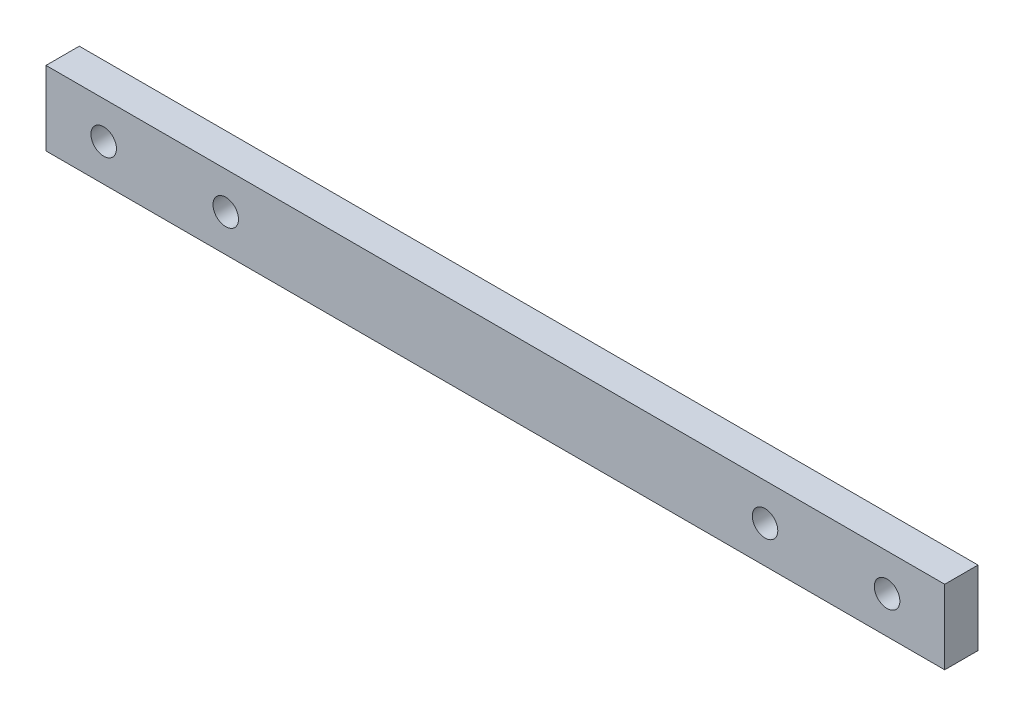
ISO-10303-21;
HEADER;
FILE_DESCRIPTION(('STEP AP214'),'2;1');
FILE_NAME('part.step','',(''),(''),'','','');
FILE_SCHEMA(('AUTOMOTIVE_DESIGN { 1 0 10303 214 1 1 1 1 }'));
ENDSEC;
DATA;
#1=APPLICATION_CONTEXT('core data for automotive mechanical design processes');
#2=APPLICATION_PROTOCOL_DEFINITION('international standard','automotive_design',2000,#1);
#3=PRODUCT_CONTEXT('',#1,'mechanical');
#4=PRODUCT('Part','Part','',(#3));
#5=PRODUCT_RELATED_PRODUCT_CATEGORY('part','',(#4));
#6=PRODUCT_DEFINITION_FORMATION('','',#4);
#7=PRODUCT_DEFINITION_CONTEXT('part definition',#1,'design');
#8=PRODUCT_DEFINITION('design','',#6,#7);
#9=PRODUCT_DEFINITION_SHAPE('','',#8);
#10=(LENGTH_UNIT() NAMED_UNIT(*) SI_UNIT(.MILLI.,.METRE.));
#11=(NAMED_UNIT(*) PLANE_ANGLE_UNIT() SI_UNIT($,.RADIAN.));
#12=(NAMED_UNIT(*) SI_UNIT($,.STERADIAN.) SOLID_ANGLE_UNIT());
#13=UNCERTAINTY_MEASURE_WITH_UNIT(LENGTH_MEASURE(1.E-05),#10,'distance_accuracy_value','');
#14=(GEOMETRIC_REPRESENTATION_CONTEXT(3) GLOBAL_UNCERTAINTY_ASSIGNED_CONTEXT((#13)) GLOBAL_UNIT_ASSIGNED_CONTEXT((#10,
#11,#12)) REPRESENTATION_CONTEXT('',''));
#15=CARTESIAN_POINT('',(0.,0.,0.));
#16=DIRECTION('',(0.,0.,1.));
#17=DIRECTION('',(1.,0.,0.));
#18=AXIS2_PLACEMENT_3D('',#15,#16,#17);
#19=CARTESIAN_POINT('',(0.,0.,3.));
#20=DIRECTION('',(0.,0.,-1.));
#21=DIRECTION('',(-1.,0.,0.));
#22=AXIS2_PLACEMENT_3D('',#19,#20,#21);
#23=PLANE('',#22);
#24=DIRECTION('',(0.,1.,0.));
#25=VECTOR('',#24,1.);
#26=CARTESIAN_POINT('',(40.497,-10.59,3.));
#27=LINE('',#26,#25);
#28=CARTESIAN_POINT('',(40.497,-17.27,3.));
#29=VERTEX_POINT('',#28);
#30=CARTESIAN_POINT('',(40.497,-10.59,3.));
#31=VERTEX_POINT('',#30);
#32=EDGE_CURVE('E92',#29,#31,#27,.T.);
#33=ORIENTED_EDGE('',*,*,#32,.T.);
#34=DIRECTION('',(-1.,0.,0.));
#35=VECTOR('',#34,1.);
#36=CARTESIAN_POINT('',(-40.497,-10.59,3.));
#37=LINE('',#36,#35);
#38=CARTESIAN_POINT('',(-40.497,-10.59,3.));
#39=VERTEX_POINT('',#38);
#40=EDGE_CURVE('E87',#31,#39,#37,.T.);
#41=ORIENTED_EDGE('',*,*,#40,.T.);
#42=DIRECTION('',(0.,-1.,0.));
#43=VECTOR('',#42,1.);
#44=CARTESIAN_POINT('',(-40.497,-17.27,3.));
#45=LINE('',#44,#43);
#46=CARTESIAN_POINT('',(-40.497,-17.27,3.));
#47=VERTEX_POINT('',#46);
#48=EDGE_CURVE('E90',#39,#47,#45,.T.);
#49=ORIENTED_EDGE('',*,*,#48,.T.);
#50=DIRECTION('',(1.,0.,0.));
#51=VECTOR('',#50,1.);
#52=CARTESIAN_POINT('',(40.497,-17.27,3.));
#53=LINE('',#52,#51);
#54=EDGE_CURVE('E57',#47,#29,#53,.T.);
#55=ORIENTED_EDGE('',*,*,#54,.T.);
#56=EDGE_LOOP('',(#33,#41,#49,#55));
#57=FACE_BOUND('',#56,.T.);
#58=CARTESIAN_POINT('',(-35.297,-13.93,3.));
#59=DIRECTION('',(0.,0.,1.));
#60=DIRECTION('',(1.,0.,0.));
#61=AXIS2_PLACEMENT_3D('',#58,#59,#60);
#62=CIRCLE('',#61,1.14999999999999);
#63=CARTESIAN_POINT('',(-34.147,-13.93,3.));
#64=VERTEX_POINT('',#63);
#65=EDGE_CURVE('E112',#64,#64,#62,.T.);
#66=ORIENTED_EDGE('',*,*,#65,.F.);
#67=EDGE_LOOP('',(#66));
#68=FACE_BOUND('',#67,.T.);
#69=CARTESIAN_POINT('',(-24.297,-13.93,3.));
#70=DIRECTION('',(0.,0.,1.));
#71=DIRECTION('',(1.,0.,0.));
#72=AXIS2_PLACEMENT_3D('',#69,#70,#71);
#73=CIRCLE('',#72,1.15);
#74=CARTESIAN_POINT('',(-23.147,-13.93,3.));
#75=VERTEX_POINT('',#74);
#76=EDGE_CURVE('E134',#75,#75,#73,.T.);
#77=ORIENTED_EDGE('',*,*,#76,.F.);
#78=EDGE_LOOP('',(#77));
#79=FACE_BOUND('',#78,.T.);
#80=CARTESIAN_POINT('',(24.303,-13.93,3.));
#81=DIRECTION('',(0.,0.,1.));
#82=DIRECTION('',(1.,0.,0.));
#83=AXIS2_PLACEMENT_3D('',#80,#81,#82);
#84=CIRCLE('',#83,1.15);
#85=CARTESIAN_POINT('',(25.453,-13.93,3.));
#86=VERTEX_POINT('',#85);
#87=EDGE_CURVE('E142',#86,#86,#84,.T.);
#88=ORIENTED_EDGE('',*,*,#87,.F.);
#89=EDGE_LOOP('',(#88));
#90=FACE_BOUND('',#89,.T.);
#91=CARTESIAN_POINT('',(35.303,-13.93,3.));
#92=DIRECTION('',(0.,0.,1.));
#93=DIRECTION('',(1.,0.,0.));
#94=AXIS2_PLACEMENT_3D('',#91,#92,#93);
#95=CIRCLE('',#94,1.14999999999999);
#96=CARTESIAN_POINT('',(36.453,-13.93,3.));
#97=VERTEX_POINT('',#96);
#98=EDGE_CURVE('E150',#97,#97,#95,.T.);
#99=ORIENTED_EDGE('',*,*,#98,.F.);
#100=EDGE_LOOP('',(#99));
#101=FACE_BOUND('',#100,.T.);
#102=ADVANCED_FACE('F39',(#57,#68,#79,#90,#101),#23,.F.);
#103=CARTESIAN_POINT('',(0.,0.,0.));
#104=DIRECTION('',(0.,0.,-1.));
#105=DIRECTION('',(-1.,0.,0.));
#106=AXIS2_PLACEMENT_3D('',#103,#104,#105);
#107=PLANE('',#106);
#108=CARTESIAN_POINT('',(24.303,-13.93,0.));
#109=DIRECTION('',(0.,0.,1.));
#110=DIRECTION('',(1.,0.,0.));
#111=AXIS2_PLACEMENT_3D('',#108,#109,#110);
#112=CIRCLE('',#111,1.15);
#113=CARTESIAN_POINT('',(25.453,-13.93,0.));
#114=VERTEX_POINT('',#113);
#115=EDGE_CURVE('E146',#114,#114,#112,.T.);
#116=ORIENTED_EDGE('',*,*,#115,.T.);
#117=EDGE_LOOP('',(#116));
#118=FACE_BOUND('',#117,.T.);
#119=CARTESIAN_POINT('',(-35.297,-13.93,0.));
#120=DIRECTION('',(0.,0.,1.));
#121=DIRECTION('',(1.,0.,0.));
#122=AXIS2_PLACEMENT_3D('',#119,#120,#121);
#123=CIRCLE('',#122,1.14999999999999);
#124=CARTESIAN_POINT('',(-34.147,-13.93,0.));
#125=VERTEX_POINT('',#124);
#126=EDGE_CURVE('E130',#125,#125,#123,.T.);
#127=ORIENTED_EDGE('',*,*,#126,.T.);
#128=EDGE_LOOP('',(#127));
#129=FACE_BOUND('',#128,.T.);
#130=DIRECTION('',(0.,1.,0.));
#131=VECTOR('',#130,1.);
#132=CARTESIAN_POINT('',(40.497,-10.59,0.));
#133=LINE('',#132,#131);
#134=CARTESIAN_POINT('',(40.497,-17.27,0.));
#135=VERTEX_POINT('',#134);
#136=CARTESIAN_POINT('',(40.497,-10.59,0.));
#137=VERTEX_POINT('',#136);
#138=EDGE_CURVE('E108',#135,#137,#133,.T.);
#139=ORIENTED_EDGE('',*,*,#138,.F.);
#140=DIRECTION('',(1.,0.,0.));
#141=VECTOR('',#140,1.);
#142=CARTESIAN_POINT('',(40.497,-17.27,0.));
#143=LINE('',#142,#141);
#144=CARTESIAN_POINT('',(-40.497,-17.27,0.));
#145=VERTEX_POINT('',#144);
#146=EDGE_CURVE('E80',#145,#135,#143,.T.);
#147=ORIENTED_EDGE('',*,*,#146,.F.);
#148=DIRECTION('',(0.,-1.,0.));
#149=VECTOR('',#148,1.);
#150=CARTESIAN_POINT('',(-40.497,-17.27,0.));
#151=LINE('',#150,#149);
#152=CARTESIAN_POINT('',(-40.497,-10.59,0.));
#153=VERTEX_POINT('',#152);
#154=EDGE_CURVE('E74',#153,#145,#151,.T.);
#155=ORIENTED_EDGE('',*,*,#154,.F.);
#156=DIRECTION('',(-1.,0.,0.));
#157=VECTOR('',#156,1.);
#158=CARTESIAN_POINT('',(-40.497,-10.59,0.));
#159=LINE('',#158,#157);
#160=EDGE_CURVE('E97',#137,#153,#159,.T.);
#161=ORIENTED_EDGE('',*,*,#160,.F.);
#162=EDGE_LOOP('',(#139,#147,#155,#161));
#163=FACE_BOUND('',#162,.T.);
#164=CARTESIAN_POINT('',(-24.297,-13.93,0.));
#165=DIRECTION('',(0.,0.,1.));
#166=DIRECTION('',(1.,0.,0.));
#167=AXIS2_PLACEMENT_3D('',#164,#165,#166);
#168=CIRCLE('',#167,1.15);
#169=CARTESIAN_POINT('',(-23.147,-13.93,0.));
#170=VERTEX_POINT('',#169);
#171=EDGE_CURVE('E138',#170,#170,#168,.T.);
#172=ORIENTED_EDGE('',*,*,#171,.T.);
#173=EDGE_LOOP('',(#172));
#174=FACE_BOUND('',#173,.T.);
#175=CARTESIAN_POINT('',(35.303,-13.93,0.));
#176=DIRECTION('',(0.,0.,1.));
#177=DIRECTION('',(1.,0.,0.));
#178=AXIS2_PLACEMENT_3D('',#175,#176,#177);
#179=CIRCLE('',#178,1.14999999999999);
#180=CARTESIAN_POINT('',(36.453,-13.93,0.));
#181=VERTEX_POINT('',#180);
#182=EDGE_CURVE('E154',#181,#181,#179,.T.);
#183=ORIENTED_EDGE('',*,*,#182,.T.);
#184=EDGE_LOOP('',(#183));
#185=FACE_BOUND('',#184,.T.);
#186=ADVANCED_FACE('F125',(#118,#129,#163,#174,#185),#107,.T.);
#187=CARTESIAN_POINT('',(40.497,-10.59,3.));
#188=DIRECTION('',(-1.,0.,0.));
#189=DIRECTION('',(0.,0.,1.));
#190=AXIS2_PLACEMENT_3D('',#187,#188,#189);
#191=PLANE('',#190);
#192=ORIENTED_EDGE('',*,*,#138,.T.);
#193=DIRECTION('',(0.,0.,-1.));
#194=VECTOR('',#193,1.);
#195=CARTESIAN_POINT('',(40.497,-10.59,3.));
#196=LINE('',#195,#194);
#197=EDGE_CURVE('E11',#31,#137,#196,.T.);
#198=ORIENTED_EDGE('',*,*,#197,.F.);
#199=ORIENTED_EDGE('',*,*,#32,.F.);
#200=DIRECTION('',(0.,0.,-1.));
#201=VECTOR('',#200,1.);
#202=CARTESIAN_POINT('',(40.497,-17.27,3.));
#203=LINE('',#202,#201);
#204=EDGE_CURVE('E104',#29,#135,#203,.T.);
#205=ORIENTED_EDGE('',*,*,#204,.T.);
#206=EDGE_LOOP('',(#192,#198,#199,#205));
#207=FACE_BOUND('',#206,.T.);
#208=ADVANCED_FACE('F41',(#207),#191,.F.);
#209=CARTESIAN_POINT('',(-40.497,-10.59,3.));
#210=DIRECTION('',(0.,-1.,0.));
#211=DIRECTION('',(1.,0.,0.));
#212=AXIS2_PLACEMENT_3D('',#209,#210,#211);
#213=PLANE('',#212);
#214=ORIENTED_EDGE('',*,*,#160,.T.);
#215=DIRECTION('',(0.,0.,-1.));
#216=VECTOR('',#215,1.);
#217=CARTESIAN_POINT('',(-40.497,-10.59,3.));
#218=LINE('',#217,#216);
#219=EDGE_CURVE('E49',#39,#153,#218,.T.);
#220=ORIENTED_EDGE('',*,*,#219,.F.);
#221=ORIENTED_EDGE('',*,*,#40,.F.);
#222=ORIENTED_EDGE('',*,*,#197,.T.);
#223=EDGE_LOOP('',(#214,#220,#221,#222));
#224=FACE_BOUND('',#223,.T.);
#225=ADVANCED_FACE('F96',(#224),#213,.F.);
#226=CARTESIAN_POINT('',(-40.497,-17.27,3.));
#227=DIRECTION('',(1.,0.,0.));
#228=DIRECTION('',(0.,0.,-1.));
#229=AXIS2_PLACEMENT_3D('',#226,#227,#228);
#230=PLANE('',#229);
#231=ORIENTED_EDGE('',*,*,#154,.T.);
#232=DIRECTION('',(0.,0.,-1.));
#233=VECTOR('',#232,1.);
#234=CARTESIAN_POINT('',(-40.497,-17.27,3.));
#235=LINE('',#234,#233);
#236=EDGE_CURVE('E99',#47,#145,#235,.T.);
#237=ORIENTED_EDGE('',*,*,#236,.F.);
#238=ORIENTED_EDGE('',*,*,#48,.F.);
#239=ORIENTED_EDGE('',*,*,#219,.T.);
#240=EDGE_LOOP('',(#231,#237,#238,#239));
#241=FACE_BOUND('',#240,.T.);
#242=ADVANCED_FACE('F100',(#241),#230,.F.);
#243=CARTESIAN_POINT('',(40.497,-17.27,3.));
#244=DIRECTION('',(0.,1.,0.));
#245=DIRECTION('',(-1.,0.,0.));
#246=AXIS2_PLACEMENT_3D('',#243,#244,#245);
#247=PLANE('',#246);
#248=ORIENTED_EDGE('',*,*,#146,.T.);
#249=ORIENTED_EDGE('',*,*,#204,.F.);
#250=ORIENTED_EDGE('',*,*,#54,.F.);
#251=ORIENTED_EDGE('',*,*,#236,.T.);
#252=EDGE_LOOP('',(#248,#249,#250,#251));
#253=FACE_BOUND('',#252,.T.);
#254=ADVANCED_FACE('F122',(#253),#247,.F.);
#255=CARTESIAN_POINT('',(-35.297,-13.93,3.));
#256=DIRECTION('',(0.,0.,-1.));
#257=DIRECTION('',(-1.,0.,0.));
#258=AXIS2_PLACEMENT_3D('',#255,#256,#257);
#259=CYLINDRICAL_SURFACE('',#258,1.14999999999999);
#260=ORIENTED_EDGE('',*,*,#65,.T.);
#261=EDGE_LOOP('',(#260));
#262=FACE_BOUND('',#261,.T.);
#263=ORIENTED_EDGE('',*,*,#126,.F.);
#264=EDGE_LOOP('',(#263));
#265=FACE_BOUND('',#264,.T.);
#266=ADVANCED_FACE('F173',(#262,#265),#259,.F.);
#267=CARTESIAN_POINT('',(-24.297,-13.93,3.));
#268=DIRECTION('',(0.,0.,-1.));
#269=DIRECTION('',(-1.,0.,0.));
#270=AXIS2_PLACEMENT_3D('',#267,#268,#269);
#271=CYLINDRICAL_SURFACE('',#270,1.15);
#272=ORIENTED_EDGE('',*,*,#76,.T.);
#273=EDGE_LOOP('',(#272));
#274=FACE_BOUND('',#273,.T.);
#275=ORIENTED_EDGE('',*,*,#171,.F.);
#276=EDGE_LOOP('',(#275));
#277=FACE_BOUND('',#276,.T.);
#278=ADVANCED_FACE('F219',(#274,#277),#271,.F.);
#279=CARTESIAN_POINT('',(24.303,-13.93,3.));
#280=DIRECTION('',(0.,0.,-1.));
#281=DIRECTION('',(-1.,0.,0.));
#282=AXIS2_PLACEMENT_3D('',#279,#280,#281);
#283=CYLINDRICAL_SURFACE('',#282,1.15);
#284=ORIENTED_EDGE('',*,*,#87,.T.);
#285=EDGE_LOOP('',(#284));
#286=FACE_BOUND('',#285,.T.);
#287=ORIENTED_EDGE('',*,*,#115,.F.);
#288=EDGE_LOOP('',(#287));
#289=FACE_BOUND('',#288,.T.);
#290=ADVANCED_FACE('F227',(#286,#289),#283,.F.);
#291=CARTESIAN_POINT('',(35.303,-13.93,3.));
#292=DIRECTION('',(0.,0.,-1.));
#293=DIRECTION('',(-1.,0.,0.));
#294=AXIS2_PLACEMENT_3D('',#291,#292,#293);
#295=CYLINDRICAL_SURFACE('',#294,1.14999999999999);
#296=ORIENTED_EDGE('',*,*,#98,.T.);
#297=EDGE_LOOP('',(#296));
#298=FACE_BOUND('',#297,.T.);
#299=ORIENTED_EDGE('',*,*,#182,.F.);
#300=EDGE_LOOP('',(#299));
#301=FACE_BOUND('',#300,.T.);
#302=ADVANCED_FACE('F162',(#298,#301),#295,.F.);
#303=CLOSED_SHELL('',(#102,#186,#208,#225,#242,#254,#266,#278,#290,#302));
#304=MANIFOLD_SOLID_BREP('B2',#303);
#305=ADVANCED_BREP_SHAPE_REPRESENTATION('',(#18,#304),#14);
#306=SHAPE_DEFINITION_REPRESENTATION(#9,#305);
ENDSEC;
END-ISO-10303-21;
